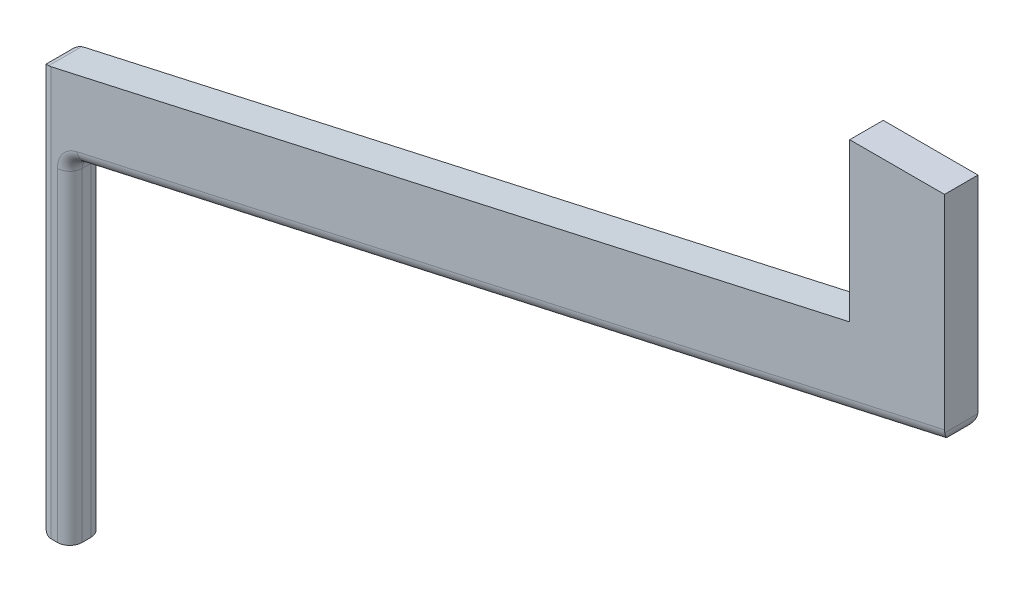
ISO-10303-21;
HEADER;
FILE_DESCRIPTION(('STEP AP214'),'2;1');
FILE_NAME('part.step','',(''),(''),'','','');
FILE_SCHEMA(('AUTOMOTIVE_DESIGN { 1 0 10303 214 1 1 1 1 }'));
ENDSEC;
DATA;
#1=APPLICATION_CONTEXT('core data for automotive mechanical design processes');
#2=APPLICATION_PROTOCOL_DEFINITION('international standard','automotive_design',2000,#1);
#3=PRODUCT_CONTEXT('',#1,'mechanical');
#4=PRODUCT('Part','Part','',(#3));
#5=PRODUCT_RELATED_PRODUCT_CATEGORY('part','',(#4));
#6=PRODUCT_DEFINITION_FORMATION('','',#4);
#7=PRODUCT_DEFINITION_CONTEXT('part definition',#1,'design');
#8=PRODUCT_DEFINITION('design','',#6,#7);
#9=PRODUCT_DEFINITION_SHAPE('','',#8);
#10=(LENGTH_UNIT() NAMED_UNIT(*) SI_UNIT(.MILLI.,.METRE.));
#11=(NAMED_UNIT(*) PLANE_ANGLE_UNIT() SI_UNIT($,.RADIAN.));
#12=(NAMED_UNIT(*) SI_UNIT($,.STERADIAN.) SOLID_ANGLE_UNIT());
#13=UNCERTAINTY_MEASURE_WITH_UNIT(LENGTH_MEASURE(1.E-05),#10,'distance_accuracy_value','');
#14=(GEOMETRIC_REPRESENTATION_CONTEXT(3) GLOBAL_UNCERTAINTY_ASSIGNED_CONTEXT((#13)) GLOBAL_UNIT_ASSIGNED_CONTEXT((#10,
#11,#12)) REPRESENTATION_CONTEXT('',''));
#15=CARTESIAN_POINT('',(0.,0.,0.));
#16=DIRECTION('',(0.,0.,1.));
#17=DIRECTION('',(1.,0.,0.));
#18=AXIS2_PLACEMENT_3D('',#15,#16,#17);
#19=CARTESIAN_POINT('',(0.25,0.,0.27));
#20=DIRECTION('',(0.,1.,0.));
#21=DIRECTION('',(-1.,0.,0.));
#22=AXIS2_PLACEMENT_3D('',#19,#20,#21);
#23=PLANE('',#22);
#24=DIRECTION('',(0.,0.,-1.));
#25=VECTOR('',#24,1.);
#26=CARTESIAN_POINT('',(0.25,0.,0.27));
#27=LINE('',#26,#25);
#28=CARTESIAN_POINT('',(0.25,0.,0.17));
#29=VERTEX_POINT('',#28);
#30=CARTESIAN_POINT('',(0.25,0.,0.1));
#31=VERTEX_POINT('',#30);
#32=EDGE_CURVE('E179',#29,#31,#27,.T.);
#33=ORIENTED_EDGE('',*,*,#32,.F.);
#34=CARTESIAN_POINT('',(0.15,0.,0.17));
#35=DIRECTION('',(0.,1.,0.));
#36=DIRECTION('',(-1.,0.,0.));
#37=AXIS2_PLACEMENT_3D('',#34,#35,#36);
#38=CIRCLE('',#37,0.1);
#39=CARTESIAN_POINT('',(0.15,0.,0.27));
#40=VERTEX_POINT('',#39);
#41=EDGE_CURVE('E229',#29,#40,#38,.F.);
#42=ORIENTED_EDGE('',*,*,#41,.T.);
#43=DIRECTION('',(1.,0.,0.));
#44=VECTOR('',#43,1.);
#45=CARTESIAN_POINT('',(0.25,0.,0.27));
#46=LINE('',#45,#44);
#47=CARTESIAN_POINT('',(0.1,0.,0.27));
#48=VERTEX_POINT('',#47);
#49=EDGE_CURVE('E170',#48,#40,#46,.T.);
#50=ORIENTED_EDGE('',*,*,#49,.F.);
#51=DIRECTION('',(0.,0.,-1.));
#52=VECTOR('',#51,1.);
#53=CARTESIAN_POINT('',(0.1,0.,0.27));
#54=LINE('',#53,#52);
#55=CARTESIAN_POINT('',(0.1,0.,0.));
#56=VERTEX_POINT('',#55);
#57=EDGE_CURVE('E225',#48,#56,#54,.T.);
#58=ORIENTED_EDGE('',*,*,#57,.T.);
#59=DIRECTION('',(1.,0.,0.));
#60=VECTOR('',#59,1.);
#61=CARTESIAN_POINT('',(0.25,0.,0.));
#62=LINE('',#61,#60);
#63=CARTESIAN_POINT('',(0.15,0.,0.));
#64=VERTEX_POINT('',#63);
#65=EDGE_CURVE('E194',#56,#64,#62,.T.);
#66=ORIENTED_EDGE('',*,*,#65,.T.);
#67=CARTESIAN_POINT('',(0.15,0.,0.1));
#68=DIRECTION('',(0.,1.,0.));
#69=DIRECTION('',(-1.,0.,0.));
#70=AXIS2_PLACEMENT_3D('',#67,#68,#69);
#71=CIRCLE('',#70,0.1);
#72=EDGE_CURVE('E227',#64,#31,#71,.F.);
#73=ORIENTED_EDGE('',*,*,#72,.T.);
#74=EDGE_LOOP('',(#33,#42,#50,#58,#66,#73));
#75=FACE_BOUND('',#74,.T.);
#76=ADVANCED_FACE('F37',(#75),#23,.F.);
#77=CARTESIAN_POINT('',(0.25,0.,0.27));
#78=DIRECTION('',(-1.,0.,0.));
#79=DIRECTION('',(0.,0.,1.));
#80=AXIS2_PLACEMENT_3D('',#77,#78,#79);
#81=PLANE('',#80);
#82=DIRECTION('',(0.,0.,-1.));
#83=VECTOR('',#82,1.);
#84=CARTESIAN_POINT('',(0.25,2.60907854273456,0.27));
#85=LINE('',#84,#83);
#86=CARTESIAN_POINT('',(0.25,2.60907854273456,0.1));
#87=VERTEX_POINT('',#86);
#88=CARTESIAN_POINT('',(0.25,2.60907854273456,0.17));
#89=VERTEX_POINT('',#88);
#90=EDGE_CURVE('E219',#87,#89,#85,.F.);
#91=ORIENTED_EDGE('',*,*,#90,.T.);
#92=DIRECTION('',(0.,1.,0.));
#93=VECTOR('',#92,1.);
#94=CARTESIAN_POINT('',(0.25,0.,0.17));
#95=LINE('',#94,#93);
#96=EDGE_CURVE('E223',#89,#29,#95,.F.);
#97=ORIENTED_EDGE('',*,*,#96,.T.);
#98=ORIENTED_EDGE('',*,*,#32,.T.);
#99=DIRECTION('',(0.,1.,0.));
#100=VECTOR('',#99,1.);
#101=CARTESIAN_POINT('',(0.25,2.68928532500017,0.1));
#102=LINE('',#101,#100);
#103=EDGE_CURVE('E221',#31,#87,#102,.T.);
#104=ORIENTED_EDGE('',*,*,#103,.T.);
#105=EDGE_LOOP('',(#91,#97,#98,#104));
#106=FACE_BOUND('',#105,.T.);
#107=ADVANCED_FACE('F329',(#106),#81,.F.);
#108=CARTESIAN_POINT('',(6.62924554365376,4.10774098232995,0.27));
#109=DIRECTION('',(-0.217053752374899,0.976159653222759,0.));
#110=DIRECTION('',(-0.976159653222759,-0.217053752374899,0.));
#111=AXIS2_PLACEMENT_3D('',#108,#109,#110);
#112=PLANE('',#111);
#113=DIRECTION('',(0.976159653222759,0.217053752374899,0.));
#114=VECTOR('',#113,1.);
#115=CARTESIAN_POINT('',(6.62924554365376,4.10774098232995,0.17));
#116=LINE('',#115,#114);
#117=CARTESIAN_POINT('',(7.21623915628656,4.23826181037423,0.17));
#118=VERTEX_POINT('',#117);
#119=CARTESIAN_POINT('',(0.32829462476251,2.70669450805683,0.17));
#120=VERTEX_POINT('',#119);
#121=EDGE_CURVE('E244',#118,#120,#116,.F.);
#122=ORIENTED_EDGE('',*,*,#121,.T.);
#123=DIRECTION('',(0.,0.,-1.));
#124=VECTOR('',#123,1.);
#125=CARTESIAN_POINT('',(0.32829462476251,2.70669450805684,0.));
#126=LINE('',#125,#124);
#127=CARTESIAN_POINT('',(0.32829462476251,2.70669450805683,0.1));
#128=VERTEX_POINT('',#127);
#129=EDGE_CURVE('E246',#120,#128,#126,.T.);
#130=ORIENTED_EDGE('',*,*,#129,.T.);
#131=DIRECTION('',(0.976159653222759,0.217053752374899,0.));
#132=VECTOR('',#131,1.);
#133=CARTESIAN_POINT('',(7.29453378104907,4.25567099343089,0.1));
#134=LINE('',#133,#132);
#135=CARTESIAN_POINT('',(7.21623915628656,4.23826181037423,0.1));
#136=VERTEX_POINT('',#135);
#137=EDGE_CURVE('E240',#128,#136,#134,.T.);
#138=ORIENTED_EDGE('',*,*,#137,.T.);
#139=DIRECTION('',(0.,0.,-1.));
#140=VECTOR('',#139,1.);
#141=CARTESIAN_POINT('',(7.21623915628656,4.23826181037423,0.27));
#142=LINE('',#141,#140);
#143=EDGE_CURVE('E242',#136,#118,#142,.F.);
#144=ORIENTED_EDGE('',*,*,#143,.T.);
#145=EDGE_LOOP('',(#122,#130,#138,#144));
#146=FACE_BOUND('',#145,.T.);
#147=ADVANCED_FACE('F355',(#146),#112,.F.);
#148=CARTESIAN_POINT('',(7.29453378104907,4.25567099343089,0.27));
#149=DIRECTION('',(-1.,0.,0.));
#150=DIRECTION('',(0.,0.,1.));
#151=AXIS2_PLACEMENT_3D('',#148,#149,#150);
#152=PLANE('',#151);
#153=DIRECTION('',(0.,1.,0.));
#154=VECTOR('',#153,1.);
#155=CARTESIAN_POINT('',(7.29453378104907,4.25567099343089,0.27));
#156=LINE('',#155,#154);
#157=CARTESIAN_POINT('',(7.29453378104907,4.35811325240959,0.27));
#158=VERTEX_POINT('',#157);
#159=CARTESIAN_POINT('',(7.29453378104907,6.,0.27));
#160=VERTEX_POINT('',#159);
#161=EDGE_CURVE('E159',#158,#160,#156,.T.);
#162=ORIENTED_EDGE('',*,*,#161,.F.);
#163=CARTESIAN_POINT('',(7.29453378104907,4.35811325240959,0.17));
#164=DIRECTION('',(-1.,0.,0.));
#165=DIRECTION('',(0.,1.,0.));
#166=AXIS2_PLACEMENT_3D('',#163,#164,#165);
#167=ELLIPSE('',#166,0.102442258978696,0.1);
#168=CARTESIAN_POINT('',(7.29453378104907,4.3358777756965,0.267615965322689));
#169=VERTEX_POINT('',#168);
#170=EDGE_CURVE('E253',#158,#169,#167,.F.);
#171=ORIENTED_EDGE('',*,*,#170,.T.);
#172=DIRECTION('',(0.,0.,-1.));
#173=VECTOR('',#172,1.);
#174=CARTESIAN_POINT('',(7.29453378104907,4.3358777756965,0.27));
#175=LINE('',#174,#173);
#176=CARTESIAN_POINT('',(7.29453378104907,4.3358777756965,0.00238403467731096));
#177=VERTEX_POINT('',#176);
#178=EDGE_CURVE('E251',#169,#177,#175,.T.);
#179=ORIENTED_EDGE('',*,*,#178,.T.);
#180=CARTESIAN_POINT('',(7.29453378104907,4.35811325240959,0.1));
#181=DIRECTION('',(-1.,0.,0.));
#182=DIRECTION('',(0.,-1.,0.));
#183=AXIS2_PLACEMENT_3D('',#180,#181,#182);
#184=ELLIPSE('',#183,0.102442258978696,0.1);
#185=CARTESIAN_POINT('',(7.29453378104907,4.35811325240959,0.));
#186=VERTEX_POINT('',#185);
#187=EDGE_CURVE('E249',#177,#186,#184,.F.);
#188=ORIENTED_EDGE('',*,*,#187,.T.);
#189=DIRECTION('',(0.,1.,0.));
#190=VECTOR('',#189,1.);
#191=CARTESIAN_POINT('',(7.29453378104907,4.25567099343089,0.));
#192=LINE('',#191,#190);
#193=CARTESIAN_POINT('',(7.29453378104907,6.,0.));
#194=VERTEX_POINT('',#193);
#195=EDGE_CURVE('E176',#186,#194,#192,.T.);
#196=ORIENTED_EDGE('',*,*,#195,.T.);
#197=DIRECTION('',(0.,0.,-1.));
#198=VECTOR('',#197,1.);
#199=CARTESIAN_POINT('',(7.29453378104907,6.,0.27));
#200=LINE('',#199,#198);
#201=EDGE_CURVE('E173',#160,#194,#200,.T.);
#202=ORIENTED_EDGE('',*,*,#201,.F.);
#203=EDGE_LOOP('',(#162,#171,#179,#188,#196,#202));
#204=FACE_BOUND('',#203,.T.);
#205=ADVANCED_FACE('F174',(#204),#152,.F.);
#206=CARTESIAN_POINT('',(6.53125,6.,0.27));
#207=DIRECTION('',(0.,-1.,0.));
#208=DIRECTION('',(0.,0.,-1.));
#209=AXIS2_PLACEMENT_3D('',#206,#207,#208);
#210=PLANE('',#209);
#211=DIRECTION('',(-1.,0.,0.));
#212=VECTOR('',#211,1.);
#213=CARTESIAN_POINT('',(6.53125,6.,0.));
#214=LINE('',#213,#212);
#215=CARTESIAN_POINT('',(6.53125,6.,0.));
#216=VERTEX_POINT('',#215);
#217=EDGE_CURVE('E199',#194,#216,#214,.T.);
#218=ORIENTED_EDGE('',*,*,#217,.T.);
#219=DIRECTION('',(0.,0.,-1.));
#220=VECTOR('',#219,1.);
#221=CARTESIAN_POINT('',(6.53125,6.,0.27));
#222=LINE('',#221,#220);
#223=CARTESIAN_POINT('',(6.53125,6.,0.27));
#224=VERTEX_POINT('',#223);
#225=EDGE_CURVE('E180',#224,#216,#222,.T.);
#226=ORIENTED_EDGE('',*,*,#225,.F.);
#227=DIRECTION('',(-1.,0.,0.));
#228=VECTOR('',#227,1.);
#229=CARTESIAN_POINT('',(6.53125,6.,0.27));
#230=LINE('',#229,#228);
#231=EDGE_CURVE('E164',#160,#224,#230,.T.);
#232=ORIENTED_EDGE('',*,*,#231,.F.);
#233=ORIENTED_EDGE('',*,*,#201,.T.);
#234=EDGE_LOOP('',(#218,#226,#232,#233));
#235=FACE_BOUND('',#234,.T.);
#236=ADVANCED_FACE('F182',(#235),#210,.F.);
#237=CARTESIAN_POINT('',(6.53125,4.72916666666667,0.27));
#238=DIRECTION('',(1.,0.,0.));
#239=DIRECTION('',(0.,0.,-1.));
#240=AXIS2_PLACEMENT_3D('',#237,#238,#239);
#241=PLANE('',#240);
#242=DIRECTION('',(0.,-1.,0.));
#243=VECTOR('',#242,1.);
#244=CARTESIAN_POINT('',(6.53125,4.72916666666667,0.));
#245=LINE('',#244,#243);
#246=CARTESIAN_POINT('',(6.53125,4.72916666666667,0.));
#247=VERTEX_POINT('',#246);
#248=EDGE_CURVE('E201',#216,#247,#245,.T.);
#249=ORIENTED_EDGE('',*,*,#248,.T.);
#250=DIRECTION('',(0.,0.,-1.));
#251=VECTOR('',#250,1.);
#252=CARTESIAN_POINT('',(6.53125,4.72916666666667,0.27));
#253=LINE('',#252,#251);
#254=CARTESIAN_POINT('',(6.53125,4.72916666666667,0.27));
#255=VERTEX_POINT('',#254);
#256=EDGE_CURVE('E193',#255,#247,#253,.T.);
#257=ORIENTED_EDGE('',*,*,#256,.F.);
#258=DIRECTION('',(0.,-1.,0.));
#259=VECTOR('',#258,1.);
#260=CARTESIAN_POINT('',(6.53125,4.72916666666667,0.27));
#261=LINE('',#260,#259);
#262=EDGE_CURVE('E185',#224,#255,#261,.T.);
#263=ORIENTED_EDGE('',*,*,#262,.F.);
#264=ORIENTED_EDGE('',*,*,#225,.T.);
#265=EDGE_LOOP('',(#249,#257,#263,#264));
#266=FACE_BOUND('',#265,.T.);
#267=ADVANCED_FACE('F391',(#266),#241,.F.);
#268=CARTESIAN_POINT('',(0.,3.27083333333333,0.27));
#269=DIRECTION('',(0.217919223664451,-0.975966808840077,0.));
#270=DIRECTION('',(0.975966808840077,0.217919223664451,0.));
#271=AXIS2_PLACEMENT_3D('',#268,#269,#270);
#272=PLANE('',#271);
#273=DIRECTION('',(0.,0.,-1.));
#274=VECTOR('',#273,1.);
#275=CARTESIAN_POINT('',(0.0782080776335549,3.28829606199154,0.27));
#276=LINE('',#275,#274);
#277=CARTESIAN_POINT('',(0.0782080776335549,3.28829606199154,0.00240331911555543));
#278=VERTEX_POINT('',#277);
#279=CARTESIAN_POINT('',(0.0782080776335549,3.28829606199154,0.267596680884445));
#280=VERTEX_POINT('',#279);
#281=EDGE_CURVE('E46',#278,#280,#276,.F.);
#282=ORIENTED_EDGE('',*,*,#281,.T.);
#283=CARTESIAN_POINT('',(0.1,3.29316188197767,0.17));
#284=DIRECTION('',(0.217919223664451,-0.975966808840077,0.));
#285=DIRECTION('',(-0.975966808840077,-0.217919223664451,0.));
#286=AXIS2_PLACEMENT_3D('',#283,#284,#285);
#287=ELLIPSE('',#286,0.102462500870136,0.1);
#288=CARTESIAN_POINT('',(0.1,3.29316188197767,0.27));
#289=VERTEX_POINT('',#288);
#290=EDGE_CURVE('E11',#280,#289,#287,.F.);
#291=ORIENTED_EDGE('',*,*,#290,.T.);
#292=DIRECTION('',(-0.975966808840077,-0.217919223664451,0.));
#293=VECTOR('',#292,1.);
#294=CARTESIAN_POINT('',(0.,3.27083333333333,0.27));
#295=LINE('',#294,#293);
#296=EDGE_CURVE('E187',#255,#289,#295,.T.);
#297=ORIENTED_EDGE('',*,*,#296,.F.);
#298=ORIENTED_EDGE('',*,*,#256,.T.);
#299=DIRECTION('',(-0.975966808840077,-0.217919223664451,0.));
#300=VECTOR('',#299,1.);
#301=CARTESIAN_POINT('',(0.,3.27083333333333,0.));
#302=LINE('',#301,#300);
#303=CARTESIAN_POINT('',(0.1,3.29316188197767,0.));
#304=VERTEX_POINT('',#303);
#305=EDGE_CURVE('E203',#247,#304,#302,.T.);
#306=ORIENTED_EDGE('',*,*,#305,.T.);
#307=CARTESIAN_POINT('',(0.1,3.29316188197767,0.1));
#308=DIRECTION('',(0.217919223664451,-0.975966808840077,0.));
#309=DIRECTION('',(0.975966808840077,0.217919223664451,0.));
#310=AXIS2_PLACEMENT_3D('',#307,#308,#309);
#311=ELLIPSE('',#310,0.102462500870136,0.1);
#312=EDGE_CURVE('E62',#304,#278,#311,.F.);
#313=ORIENTED_EDGE('',*,*,#312,.T.);
#314=EDGE_LOOP('',(#282,#291,#297,#298,#306,#313));
#315=FACE_BOUND('',#314,.T.);
#316=ADVANCED_FACE('F337',(#315),#272,.F.);
#317=CARTESIAN_POINT('',(0.,0.,0.27));
#318=DIRECTION('',(1.,0.,0.));
#319=DIRECTION('',(0.,0.,-1.));
#320=AXIS2_PLACEMENT_3D('',#317,#318,#319);
#321=PLANE('',#320);
#322=DIRECTION('',(0.,-1.,0.));
#323=VECTOR('',#322,1.);
#324=CARTESIAN_POINT('',(0.,0.,0.17));
#325=LINE('',#324,#323);
#326=CARTESIAN_POINT('',(0.,0.1,0.17));
#327=VERTEX_POINT('',#326);
#328=CARTESIAN_POINT('',(0.,3.19069938110754,0.17));
#329=VERTEX_POINT('',#328);
#330=EDGE_CURVE('E259',#327,#329,#325,.F.);
#331=ORIENTED_EDGE('',*,*,#330,.T.);
#332=DIRECTION('',(0.,0.,-1.));
#333=VECTOR('',#332,1.);
#334=CARTESIAN_POINT('',(0.,3.19069938110754,0.27));
#335=LINE('',#334,#333);
#336=CARTESIAN_POINT('',(0.,3.19069938110754,0.1));
#337=VERTEX_POINT('',#336);
#338=EDGE_CURVE('E261',#329,#337,#335,.T.);
#339=ORIENTED_EDGE('',*,*,#338,.T.);
#340=DIRECTION('',(0.,-1.,0.));
#341=VECTOR('',#340,1.);
#342=CARTESIAN_POINT('',(0.,0.,0.1));
#343=LINE('',#342,#341);
#344=CARTESIAN_POINT('',(0.,0.1,0.1));
#345=VERTEX_POINT('',#344);
#346=EDGE_CURVE('E255',#337,#345,#343,.T.);
#347=ORIENTED_EDGE('',*,*,#346,.T.);
#348=DIRECTION('',(0.,0.,-1.));
#349=VECTOR('',#348,1.);
#350=CARTESIAN_POINT('',(0.,0.1,0.27));
#351=LINE('',#350,#349);
#352=EDGE_CURVE('E257',#345,#327,#351,.F.);
#353=ORIENTED_EDGE('',*,*,#352,.T.);
#354=EDGE_LOOP('',(#331,#339,#347,#353));
#355=FACE_BOUND('',#354,.T.);
#356=ADVANCED_FACE('F341',(#355),#321,.F.);
#357=CARTESIAN_POINT('',(0.,0.,0.27));
#358=DIRECTION('',(0.,0.,-1.));
#359=DIRECTION('',(-1.,0.,0.));
#360=AXIS2_PLACEMENT_3D('',#357,#358,#359);
#361=PLANE('',#360);
#362=ORIENTED_EDGE('',*,*,#49,.T.);
#363=DIRECTION('',(0.,1.,0.));
#364=VECTOR('',#363,1.);
#365=CARTESIAN_POINT('',(0.15,0.,0.27));
#366=LINE('',#365,#364);
#367=CARTESIAN_POINT('',(0.15,2.60907854273456,0.27));
#368=VERTEX_POINT('',#367);
#369=EDGE_CURVE('E216',#40,#368,#366,.T.);
#370=ORIENTED_EDGE('',*,*,#369,.T.);
#371=CARTESIAN_POINT('',(0.35,2.60907854273456,0.27));
#372=DIRECTION('',(0.,0.,-1.));
#373=DIRECTION('',(-1.,0.,0.));
#374=AXIS2_PLACEMENT_3D('',#371,#372,#373);
#375=CIRCLE('',#374,0.2);
#376=CARTESIAN_POINT('',(0.30658924952502,2.80431047337911,0.27));
#377=VERTEX_POINT('',#376);
#378=EDGE_CURVE('E213',#377,#368,#375,.F.);
#379=ORIENTED_EDGE('',*,*,#378,.F.);
#380=DIRECTION('',(0.976159653222759,0.217053752374899,0.));
#381=VECTOR('',#380,1.);
#382=CARTESIAN_POINT('',(-0.579730688771298,2.60723300989578,0.27));
#383=LINE('',#382,#381);
#384=EDGE_CURVE('E167',#377,#158,#383,.T.);
#385=ORIENTED_EDGE('',*,*,#384,.T.);
#386=ORIENTED_EDGE('',*,*,#161,.T.);
#387=ORIENTED_EDGE('',*,*,#231,.T.);
#388=ORIENTED_EDGE('',*,*,#262,.T.);
#389=ORIENTED_EDGE('',*,*,#296,.T.);
#390=DIRECTION('',(0.,-1.,0.));
#391=VECTOR('',#390,1.);
#392=CARTESIAN_POINT('',(0.1,0.,0.27));
#393=LINE('',#392,#391);
#394=EDGE_CURVE('E210',#289,#48,#393,.T.);
#395=ORIENTED_EDGE('',*,*,#394,.T.);
#396=EDGE_LOOP('',(#362,#370,#379,#385,#386,#387,#388,#389,#395));
#397=FACE_BOUND('',#396,.T.);
#398=ADVANCED_FACE('F162',(#397),#361,.F.);
#399=CARTESIAN_POINT('',(0.,0.,0.));
#400=DIRECTION('',(0.,0.,-1.));
#401=DIRECTION('',(-1.,0.,0.));
#402=AXIS2_PLACEMENT_3D('',#399,#400,#401);
#403=PLANE('',#402);
#404=CARTESIAN_POINT('',(0.35,2.60907854273456,0.));
#405=DIRECTION('',(0.,0.,-1.));
#406=DIRECTION('',(-1.,0.,0.));
#407=AXIS2_PLACEMENT_3D('',#404,#405,#406);
#408=CIRCLE('',#407,0.2);
#409=CARTESIAN_POINT('',(0.15,2.60907854273456,0.));
#410=VERTEX_POINT('',#409);
#411=CARTESIAN_POINT('',(0.30658924952502,2.80431047337911,0.));
#412=VERTEX_POINT('',#411);
#413=EDGE_CURVE('E233',#410,#412,#408,.T.);
#414=ORIENTED_EDGE('',*,*,#413,.F.);
#415=DIRECTION('',(0.,1.,0.));
#416=VECTOR('',#415,1.);
#417=CARTESIAN_POINT('',(0.15,0.,0.));
#418=LINE('',#417,#416);
#419=EDGE_CURVE('E238',#410,#64,#418,.F.);
#420=ORIENTED_EDGE('',*,*,#419,.T.);
#421=ORIENTED_EDGE('',*,*,#65,.F.);
#422=DIRECTION('',(0.,-1.,0.));
#423=VECTOR('',#422,1.);
#424=CARTESIAN_POINT('',(0.1,3.27083333333333,0.));
#425=LINE('',#424,#423);
#426=EDGE_CURVE('E231',#56,#304,#425,.F.);
#427=ORIENTED_EDGE('',*,*,#426,.T.);
#428=ORIENTED_EDGE('',*,*,#305,.F.);
#429=ORIENTED_EDGE('',*,*,#248,.F.);
#430=ORIENTED_EDGE('',*,*,#217,.F.);
#431=ORIENTED_EDGE('',*,*,#195,.F.);
#432=DIRECTION('',(0.976159653222759,0.217053752374899,0.));
#433=VECTOR('',#432,1.);
#434=CARTESIAN_POINT('',(0.22829462476251,2.78690129032244,0.));
#435=LINE('',#434,#433);
#436=EDGE_CURVE('E236',#186,#412,#435,.F.);
#437=ORIENTED_EDGE('',*,*,#436,.T.);
#438=EDGE_LOOP('',(#414,#420,#421,#427,#428,#429,#430,#431,#437));
#439=FACE_BOUND('',#438,.T.);
#440=ADVANCED_FACE('F310',(#439),#403,.T.);
#441=CARTESIAN_POINT('',(6.60754016841627,4.20535694765223,0.1));
#442=DIRECTION('',(-0.976159653222759,-0.217053752374899,0.));
#443=DIRECTION('',(0.217053752374899,-0.976159653222759,0.));
#444=AXIS2_PLACEMENT_3D('',#441,#442,#443);
#445=CYLINDRICAL_SURFACE('',#444,0.1);
#446=ORIENTED_EDGE('',*,*,#436,.F.);
#447=ORIENTED_EDGE('',*,*,#187,.F.);
#448=CARTESIAN_POINT('',(7.19453378104907,4.3358777756965,0.1));
#449=DIRECTION('',(-0.690249110314521,-0.153480180186277,-0.707106781186547));
#450=DIRECTION('',(-0.690249110314521,-0.153480180186277,0.707106781186547));
#451=AXIS2_PLACEMENT_3D('',#448,#449,#450);
#452=ELLIPSE('',#451,0.14142135623731,0.1);
#453=EDGE_CURVE('E197',#136,#177,#452,.F.);
#454=ORIENTED_EDGE('',*,*,#453,.F.);
#455=ORIENTED_EDGE('',*,*,#137,.F.);
#456=CARTESIAN_POINT('',(0.30658924952502,2.80431047337911,0.1));
#457=DIRECTION('',(-0.976159653222758,-0.217053752374899,0.));
#458=DIRECTION('',(0.217053752374899,-0.976159653222759,0.));
#459=AXIS2_PLACEMENT_3D('',#456,#457,#458);
#460=CIRCLE('',#459,0.1);
#461=EDGE_CURVE('E282',#412,#128,#460,.T.);
#462=ORIENTED_EDGE('',*,*,#461,.F.);
#463=EDGE_LOOP('',(#446,#447,#454,#455,#462));
#464=FACE_BOUND('',#463,.T.);
#465=ADVANCED_FACE('F379',(#464),#445,.T.);
#466=CARTESIAN_POINT('',(0.15,0.,0.1));
#467=DIRECTION('',(0.,-1.,0.));
#468=DIRECTION('',(0.,0.,-1.));
#469=AXIS2_PLACEMENT_3D('',#466,#467,#468);
#470=CYLINDRICAL_SURFACE('',#469,0.1);
#471=ORIENTED_EDGE('',*,*,#72,.F.);
#472=ORIENTED_EDGE('',*,*,#419,.F.);
#473=CARTESIAN_POINT('',(0.15,2.60907854273456,0.1));
#474=DIRECTION('',(0.,1.,0.));
#475=DIRECTION('',(0.,0.,1.));
#476=AXIS2_PLACEMENT_3D('',#473,#474,#475);
#477=CIRCLE('',#476,0.1);
#478=EDGE_CURVE('E279',#87,#410,#477,.T.);
#479=ORIENTED_EDGE('',*,*,#478,.F.);
#480=ORIENTED_EDGE('',*,*,#103,.F.);
#481=EDGE_LOOP('',(#471,#472,#479,#480));
#482=FACE_BOUND('',#481,.T.);
#483=ADVANCED_FACE('F315',(#482),#470,.T.);
#484=CARTESIAN_POINT('',(7.19453378104907,4.3358777756965,0.27));
#485=DIRECTION('',(0.,0.,-1.));
#486=DIRECTION('',(-1.,0.,0.));
#487=AXIS2_PLACEMENT_3D('',#484,#485,#486);
#488=CYLINDRICAL_SURFACE('',#487,0.1);
#489=ORIENTED_EDGE('',*,*,#453,.T.);
#490=ORIENTED_EDGE('',*,*,#178,.F.);
#491=CARTESIAN_POINT('',(7.19453378104907,4.3358777756965,0.17));
#492=DIRECTION('',(0.690249110314521,0.153480180186277,-0.707106781186547));
#493=DIRECTION('',(-0.690249110314521,-0.153480180186277,-0.707106781186547));
#494=AXIS2_PLACEMENT_3D('',#491,#492,#493);
#495=ELLIPSE('',#494,0.14142135623731,0.1);
#496=EDGE_CURVE('E276',#118,#169,#495,.F.);
#497=ORIENTED_EDGE('',*,*,#496,.F.);
#498=ORIENTED_EDGE('',*,*,#143,.F.);
#499=EDGE_LOOP('',(#489,#490,#497,#498));
#500=FACE_BOUND('',#499,.T.);
#501=ADVANCED_FACE('F373',(#500),#488,.T.);
#502=CARTESIAN_POINT('',(0.35,2.60907854273456,0.1));
#503=DIRECTION('',(0.,0.,-1.));
#504=DIRECTION('',(-1.,0.,0.));
#505=AXIS2_PLACEMENT_3D('',#502,#503,#504);
#506=TOROIDAL_SURFACE('',#505,0.2,0.1);
#507=ORIENTED_EDGE('',*,*,#413,.T.);
#508=ORIENTED_EDGE('',*,*,#461,.T.);
#509=CARTESIAN_POINT('',(0.35,2.60907854273456,0.1));
#510=DIRECTION('',(0.,0.,-1.));
#511=DIRECTION('',(-1.,0.,0.));
#512=AXIS2_PLACEMENT_3D('',#509,#510,#511);
#513=CIRCLE('',#512,0.1);
#514=EDGE_CURVE('E274',#87,#128,#513,.T.);
#515=ORIENTED_EDGE('',*,*,#514,.F.);
#516=ORIENTED_EDGE('',*,*,#478,.T.);
#517=EDGE_LOOP('',(#507,#508,#515,#516));
#518=FACE_BOUND('',#517,.T.);
#519=ADVANCED_FACE('F319',(#518),#506,.T.);
#520=CARTESIAN_POINT('',(-0.579730688771298,2.60723300989578,0.17));
#521=DIRECTION('',(0.976159653222759,0.217053752374899,0.));
#522=DIRECTION('',(-0.217053752374899,0.976159653222759,0.));
#523=AXIS2_PLACEMENT_3D('',#520,#521,#522);
#524=CYLINDRICAL_SURFACE('',#523,0.1);
#525=ORIENTED_EDGE('',*,*,#170,.F.);
#526=ORIENTED_EDGE('',*,*,#384,.F.);
#527=CARTESIAN_POINT('',(0.30658924952502,2.80431047337911,0.17));
#528=DIRECTION('',(-0.976159653222758,-0.217053752374899,0.));
#529=DIRECTION('',(0.217053752374899,-0.976159653222759,0.));
#530=AXIS2_PLACEMENT_3D('',#527,#528,#529);
#531=CIRCLE('',#530,0.1);
#532=EDGE_CURVE('E271',#120,#377,#531,.T.);
#533=ORIENTED_EDGE('',*,*,#532,.F.);
#534=ORIENTED_EDGE('',*,*,#121,.F.);
#535=ORIENTED_EDGE('',*,*,#496,.T.);
#536=EDGE_LOOP('',(#525,#526,#533,#534,#535));
#537=FACE_BOUND('',#536,.T.);
#538=ADVANCED_FACE('F367',(#537),#524,.T.);
#539=CARTESIAN_POINT('',(0.35,2.60907854273456,0.27));
#540=DIRECTION('',(0.,0.,1.));
#541=DIRECTION('',(1.,0.,0.));
#542=AXIS2_PLACEMENT_3D('',#539,#540,#541);
#543=CYLINDRICAL_SURFACE('',#542,0.1);
#544=ORIENTED_EDGE('',*,*,#514,.T.);
#545=ORIENTED_EDGE('',*,*,#129,.F.);
#546=CARTESIAN_POINT('',(0.35,2.60907854273456,0.17));
#547=DIRECTION('',(0.,0.,-1.));
#548=DIRECTION('',(-1.,0.,0.));
#549=AXIS2_PLACEMENT_3D('',#546,#547,#548);
#550=CIRCLE('',#549,0.1);
#551=EDGE_CURVE('E268',#89,#120,#550,.T.);
#552=ORIENTED_EDGE('',*,*,#551,.F.);
#553=ORIENTED_EDGE('',*,*,#90,.F.);
#554=EDGE_LOOP('',(#544,#545,#552,#553));
#555=FACE_BOUND('',#554,.T.);
#556=ADVANCED_FACE('F326',(#555),#543,.F.);
#557=CARTESIAN_POINT('',(0.35,2.60907854273456,0.17));
#558=DIRECTION('',(0.,0.,-1.));
#559=DIRECTION('',(-1.,0.,0.));
#560=AXIS2_PLACEMENT_3D('',#557,#558,#559);
#561=TOROIDAL_SURFACE('',#560,0.2,0.1);
#562=ORIENTED_EDGE('',*,*,#532,.T.);
#563=ORIENTED_EDGE('',*,*,#378,.T.);
#564=CARTESIAN_POINT('',(0.15,2.60907854273456,0.17));
#565=DIRECTION('',(0.,1.,0.));
#566=DIRECTION('',(0.,0.,1.));
#567=AXIS2_PLACEMENT_3D('',#564,#565,#566);
#568=CIRCLE('',#567,0.1);
#569=EDGE_CURVE('E266',#89,#368,#568,.F.);
#570=ORIENTED_EDGE('',*,*,#569,.F.);
#571=ORIENTED_EDGE('',*,*,#551,.T.);
#572=EDGE_LOOP('',(#562,#563,#570,#571));
#573=FACE_BOUND('',#572,.T.);
#574=ADVANCED_FACE('F361',(#573),#561,.T.);
#575=CARTESIAN_POINT('',(0.15,0.,0.17));
#576=DIRECTION('',(0.,1.,0.));
#577=DIRECTION('',(0.,0.,1.));
#578=AXIS2_PLACEMENT_3D('',#575,#576,#577);
#579=CYLINDRICAL_SURFACE('',#578,0.1);
#580=ORIENTED_EDGE('',*,*,#41,.F.);
#581=ORIENTED_EDGE('',*,*,#96,.F.);
#582=ORIENTED_EDGE('',*,*,#569,.T.);
#583=ORIENTED_EDGE('',*,*,#369,.F.);
#584=EDGE_LOOP('',(#580,#581,#582,#583));
#585=FACE_BOUND('',#584,.T.);
#586=ADVANCED_FACE('F333',(#585),#579,.T.);
#587=CARTESIAN_POINT('',(0.1,0.1,0.27));
#588=DIRECTION('',(0.,0.,-1.));
#589=DIRECTION('',(-1.,0.,0.));
#590=AXIS2_PLACEMENT_3D('',#587,#588,#589);
#591=CYLINDRICAL_SURFACE('',#590,0.1);
#592=CARTESIAN_POINT('',(0.1,0.1,0.1));
#593=DIRECTION('',(0.,0.707106781186547,-0.707106781186547));
#594=DIRECTION('',(0.,0.707106781186547,0.707106781186547));
#595=AXIS2_PLACEMENT_3D('',#592,#593,#594);
#596=ELLIPSE('',#595,0.14142135623731,0.1);
#597=EDGE_CURVE('E289',#56,#345,#596,.T.);
#598=ORIENTED_EDGE('',*,*,#597,.F.);
#599=ORIENTED_EDGE('',*,*,#57,.F.);
#600=CARTESIAN_POINT('',(0.1,0.1,0.17));
#601=DIRECTION('',(0.,-0.707106781186547,-0.707106781186547));
#602=DIRECTION('',(0.,0.707106781186547,-0.707106781186547));
#603=AXIS2_PLACEMENT_3D('',#600,#601,#602);
#604=ELLIPSE('',#603,0.14142135623731,0.1);
#605=EDGE_CURVE('E41',#327,#48,#604,.F.);
#606=ORIENTED_EDGE('',*,*,#605,.F.);
#607=ORIENTED_EDGE('',*,*,#352,.F.);
#608=EDGE_LOOP('',(#598,#599,#606,#607));
#609=FACE_BOUND('',#608,.T.);
#610=ADVANCED_FACE('F39',(#609),#591,.T.);
#611=CARTESIAN_POINT('',(0.1,0.,0.17));
#612=DIRECTION('',(0.,-1.,0.));
#613=DIRECTION('',(0.,0.,-1.));
#614=AXIS2_PLACEMENT_3D('',#611,#612,#613);
#615=CYLINDRICAL_SURFACE('',#614,0.1);
#616=ORIENTED_EDGE('',*,*,#394,.F.);
#617=ORIENTED_EDGE('',*,*,#290,.F.);
#618=CARTESIAN_POINT('',(0.1,3.19069938110754,0.17));
#619=DIRECTION('',(0.,-0.707106781186547,0.707106781186547));
#620=DIRECTION('',(0.,-0.707106781186547,-0.707106781186547));
#621=AXIS2_PLACEMENT_3D('',#618,#619,#620);
#622=ELLIPSE('',#621,0.14142135623731,0.1);
#623=EDGE_CURVE('E54',#329,#280,#622,.F.);
#624=ORIENTED_EDGE('',*,*,#623,.F.);
#625=ORIENTED_EDGE('',*,*,#330,.F.);
#626=ORIENTED_EDGE('',*,*,#605,.T.);
#627=EDGE_LOOP('',(#616,#617,#624,#625,#626));
#628=FACE_BOUND('',#627,.T.);
#629=ADVANCED_FACE('F300',(#628),#615,.T.);
#630=CARTESIAN_POINT('',(0.1,0.,0.1));
#631=DIRECTION('',(0.,1.,0.));
#632=DIRECTION('',(0.,0.,1.));
#633=AXIS2_PLACEMENT_3D('',#630,#631,#632);
#634=CYLINDRICAL_SURFACE('',#633,0.1);
#635=ORIENTED_EDGE('',*,*,#597,.T.);
#636=ORIENTED_EDGE('',*,*,#346,.F.);
#637=CARTESIAN_POINT('',(0.1,3.19069938110754,0.1));
#638=DIRECTION('',(0.,0.707106781186547,0.707106781186547));
#639=DIRECTION('',(0.,0.707106781186547,-0.707106781186547));
#640=AXIS2_PLACEMENT_3D('',#637,#638,#639);
#641=ELLIPSE('',#640,0.14142135623731,0.1);
#642=EDGE_CURVE('E287',#278,#337,#641,.T.);
#643=ORIENTED_EDGE('',*,*,#642,.F.);
#644=ORIENTED_EDGE('',*,*,#312,.F.);
#645=ORIENTED_EDGE('',*,*,#426,.F.);
#646=EDGE_LOOP('',(#635,#636,#643,#644,#645));
#647=FACE_BOUND('',#646,.T.);
#648=ADVANCED_FACE('F342',(#647),#634,.T.);
#649=CARTESIAN_POINT('',(0.1,3.19069938110754,0.27));
#650=DIRECTION('',(0.,0.,-1.));
#651=DIRECTION('',(-1.,0.,0.));
#652=AXIS2_PLACEMENT_3D('',#649,#650,#651);
#653=CYLINDRICAL_SURFACE('',#652,0.1);
#654=ORIENTED_EDGE('',*,*,#623,.T.);
#655=ORIENTED_EDGE('',*,*,#281,.F.);
#656=ORIENTED_EDGE('',*,*,#642,.T.);
#657=ORIENTED_EDGE('',*,*,#338,.F.);
#658=EDGE_LOOP('',(#654,#655,#656,#657));
#659=FACE_BOUND('',#658,.T.);
#660=ADVANCED_FACE('F338',(#659),#653,.T.);
#661=CLOSED_SHELL('',(#76,#107,#147,#205,#236,#267,#316,#356,#398,#440,#465,#483,#501,#519,#538,
#556,#574,#586,#610,#629,#648,#660));
#662=MANIFOLD_SOLID_BREP('B2',#661);
#663=ADVANCED_BREP_SHAPE_REPRESENTATION('',(#18,#662),#14);
#664=SHAPE_DEFINITION_REPRESENTATION(#9,#663);
ENDSEC;
END-ISO-10303-21;
